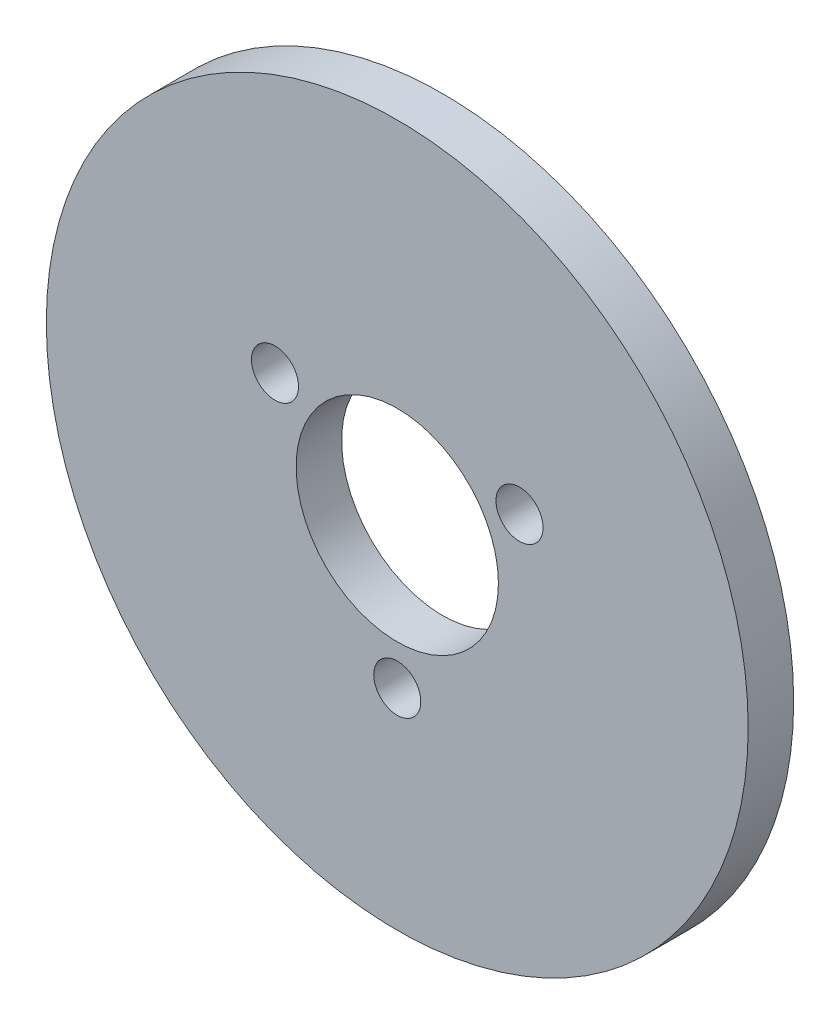
ISO-10303-21;
HEADER;
FILE_DESCRIPTION(('STEP AP214'),'2;1');
FILE_NAME('part.step','',(''),(''),'','','');
FILE_SCHEMA(('AUTOMOTIVE_DESIGN { 1 0 10303 214 1 1 1 1 }'));
ENDSEC;
DATA;
#1=APPLICATION_CONTEXT('core data for automotive mechanical design processes');
#2=APPLICATION_PROTOCOL_DEFINITION('international standard','automotive_design',2000,#1);
#3=PRODUCT_CONTEXT('',#1,'mechanical');
#4=PRODUCT('Part','Part','',(#3));
#5=PRODUCT_RELATED_PRODUCT_CATEGORY('part','',(#4));
#6=PRODUCT_DEFINITION_FORMATION('','',#4);
#7=PRODUCT_DEFINITION_CONTEXT('part definition',#1,'design');
#8=PRODUCT_DEFINITION('design','',#6,#7);
#9=PRODUCT_DEFINITION_SHAPE('','',#8);
#10=(LENGTH_UNIT() NAMED_UNIT(*) SI_UNIT(.MILLI.,.METRE.));
#11=(NAMED_UNIT(*) PLANE_ANGLE_UNIT() SI_UNIT($,.RADIAN.));
#12=(NAMED_UNIT(*) SI_UNIT($,.STERADIAN.) SOLID_ANGLE_UNIT());
#13=UNCERTAINTY_MEASURE_WITH_UNIT(LENGTH_MEASURE(1.E-05),#10,'distance_accuracy_value','');
#14=(GEOMETRIC_REPRESENTATION_CONTEXT(3) GLOBAL_UNCERTAINTY_ASSIGNED_CONTEXT((#13)) GLOBAL_UNIT_ASSIGNED_CONTEXT((#10,
#11,#12)) REPRESENTATION_CONTEXT('',''));
#15=CARTESIAN_POINT('',(0.,0.,0.));
#16=DIRECTION('',(0.,0.,1.));
#17=DIRECTION('',(1.,0.,0.));
#18=AXIS2_PLACEMENT_3D('',#15,#16,#17);
#19=CARTESIAN_POINT('',(0.,0.,2.9));
#20=DIRECTION('',(0.,0.,1.));
#21=DIRECTION('',(1.,0.,0.));
#22=AXIS2_PLACEMENT_3D('',#19,#20,#21);
#23=PLANE('',#22);
#24=CARTESIAN_POINT('',(7.79422863405995,4.5,2.9));
#25=DIRECTION('',(0.,0.,-1.));
#26=DIRECTION('',(-1.,0.,0.));
#27=AXIS2_PLACEMENT_3D('',#24,#25,#26);
#28=CIRCLE('',#27,1.5);
#29=CARTESIAN_POINT('',(6.29422863405995,4.5,2.9));
#30=VERTEX_POINT('',#29);
#31=EDGE_CURVE('E52',#30,#30,#28,.T.);
#32=ORIENTED_EDGE('',*,*,#31,.T.);
#33=EDGE_LOOP('',(#32));
#34=FACE_BOUND('',#33,.T.);
#35=CARTESIAN_POINT('',(0.,-9.,2.9));
#36=DIRECTION('',(0.,0.,-1.));
#37=DIRECTION('',(-1.,0.,0.));
#38=AXIS2_PLACEMENT_3D('',#35,#36,#37);
#39=CIRCLE('',#38,1.5);
#40=CARTESIAN_POINT('',(-1.5,-9.,2.9));
#41=VERTEX_POINT('',#40);
#42=EDGE_CURVE('E58',#41,#41,#39,.T.);
#43=ORIENTED_EDGE('',*,*,#42,.T.);
#44=EDGE_LOOP('',(#43));
#45=FACE_BOUND('',#44,.T.);
#46=CARTESIAN_POINT('',(-7.79422863405995,4.5,2.9));
#47=DIRECTION('',(0.,0.,-1.));
#48=DIRECTION('',(-1.,0.,0.));
#49=AXIS2_PLACEMENT_3D('',#46,#47,#48);
#50=CIRCLE('',#49,1.5);
#51=CARTESIAN_POINT('',(-9.29422863405994,4.5,2.9));
#52=VERTEX_POINT('',#51);
#53=EDGE_CURVE('E46',#52,#52,#50,.T.);
#54=ORIENTED_EDGE('',*,*,#53,.T.);
#55=EDGE_LOOP('',(#54));
#56=FACE_BOUND('',#55,.T.);
#57=CARTESIAN_POINT('',(0.,0.,2.9));
#58=DIRECTION('',(0.,0.,1.));
#59=DIRECTION('',(1.,0.,0.));
#60=AXIS2_PLACEMENT_3D('',#57,#58,#59);
#61=CIRCLE('',#60,22.375);
#62=CARTESIAN_POINT('',(22.375,0.,2.9));
#63=VERTEX_POINT('',#62);
#64=EDGE_CURVE('E10',#63,#63,#61,.T.);
#65=ORIENTED_EDGE('',*,*,#64,.T.);
#66=EDGE_LOOP('',(#65));
#67=FACE_BOUND('',#66,.T.);
#68=CARTESIAN_POINT('',(0.,0.,2.9));
#69=DIRECTION('',(0.,0.,1.));
#70=DIRECTION('',(1.,0.,0.));
#71=AXIS2_PLACEMENT_3D('',#68,#69,#70);
#72=CIRCLE('',#71,6.45);
#73=CARTESIAN_POINT('',(6.45,0.,2.9));
#74=VERTEX_POINT('',#73);
#75=EDGE_CURVE('E41',#74,#74,#72,.T.);
#76=ORIENTED_EDGE('',*,*,#75,.F.);
#77=EDGE_LOOP('',(#76));
#78=FACE_BOUND('',#77,.T.);
#79=ADVANCED_FACE('F30',(#34,#45,#56,#67,#78),#23,.T.);
#80=CARTESIAN_POINT('',(0.,0.,0.));
#81=DIRECTION('',(0.,0.,1.));
#82=DIRECTION('',(1.,0.,0.));
#83=AXIS2_PLACEMENT_3D('',#80,#81,#82);
#84=PLANE('',#83);
#85=CARTESIAN_POINT('',(7.79422863405995,4.5,0.));
#86=DIRECTION('',(0.,0.,-1.));
#87=DIRECTION('',(-1.,0.,0.));
#88=AXIS2_PLACEMENT_3D('',#85,#86,#87);
#89=CIRCLE('',#88,1.5);
#90=CARTESIAN_POINT('',(6.29422863405995,4.5,0.));
#91=VERTEX_POINT('',#90);
#92=EDGE_CURVE('E61',#91,#91,#89,.T.);
#93=ORIENTED_EDGE('',*,*,#92,.F.);
#94=EDGE_LOOP('',(#93));
#95=FACE_BOUND('',#94,.T.);
#96=CARTESIAN_POINT('',(0.,-9.,0.));
#97=DIRECTION('',(0.,0.,-1.));
#98=DIRECTION('',(-1.,0.,0.));
#99=AXIS2_PLACEMENT_3D('',#96,#97,#98);
#100=CIRCLE('',#99,1.5);
#101=CARTESIAN_POINT('',(-1.5,-9.,0.));
#102=VERTEX_POINT('',#101);
#103=EDGE_CURVE('E55',#102,#102,#100,.T.);
#104=ORIENTED_EDGE('',*,*,#103,.F.);
#105=EDGE_LOOP('',(#104));
#106=FACE_BOUND('',#105,.T.);
#107=CARTESIAN_POINT('',(-7.79422863405995,4.5,0.));
#108=DIRECTION('',(0.,0.,-1.));
#109=DIRECTION('',(-1.,0.,0.));
#110=AXIS2_PLACEMENT_3D('',#107,#108,#109);
#111=CIRCLE('',#110,1.5);
#112=CARTESIAN_POINT('',(-9.29422863405994,4.5,0.));
#113=VERTEX_POINT('',#112);
#114=EDGE_CURVE('E49',#113,#113,#111,.T.);
#115=ORIENTED_EDGE('',*,*,#114,.F.);
#116=EDGE_LOOP('',(#115));
#117=FACE_BOUND('',#116,.T.);
#118=CARTESIAN_POINT('',(0.,0.,0.));
#119=DIRECTION('',(0.,0.,1.));
#120=DIRECTION('',(1.,0.,0.));
#121=AXIS2_PLACEMENT_3D('',#118,#119,#120);
#122=CIRCLE('',#121,22.375);
#123=CARTESIAN_POINT('',(22.375,0.,0.));
#124=VERTEX_POINT('',#123);
#125=EDGE_CURVE('E34',#124,#124,#122,.T.);
#126=ORIENTED_EDGE('',*,*,#125,.F.);
#127=EDGE_LOOP('',(#126));
#128=FACE_BOUND('',#127,.T.);
#129=CARTESIAN_POINT('',(0.,0.,0.));
#130=DIRECTION('',(0.,0.,1.));
#131=DIRECTION('',(1.,0.,0.));
#132=AXIS2_PLACEMENT_3D('',#129,#130,#131);
#133=CIRCLE('',#132,6.45);
#134=CARTESIAN_POINT('',(6.45,0.,0.));
#135=VERTEX_POINT('',#134);
#136=EDGE_CURVE('E43',#135,#135,#133,.T.);
#137=ORIENTED_EDGE('',*,*,#136,.T.);
#138=EDGE_LOOP('',(#137));
#139=FACE_BOUND('',#138,.T.);
#140=ADVANCED_FACE('F76',(#95,#106,#117,#128,#139),#84,.F.);
#141=CARTESIAN_POINT('',(0.,0.,2.9));
#142=DIRECTION('',(0.,0.,-1.));
#143=DIRECTION('',(-1.,0.,0.));
#144=AXIS2_PLACEMENT_3D('',#141,#142,#143);
#145=CYLINDRICAL_SURFACE('',#144,22.375);
#146=ORIENTED_EDGE('',*,*,#64,.F.);
#147=EDGE_LOOP('',(#146));
#148=FACE_BOUND('',#147,.T.);
#149=ORIENTED_EDGE('',*,*,#125,.T.);
#150=EDGE_LOOP('',(#149));
#151=FACE_BOUND('',#150,.T.);
#152=ADVANCED_FACE('F32',(#148,#151),#145,.T.);
#153=CARTESIAN_POINT('',(0.,0.,2.9));
#154=DIRECTION('',(0.,0.,-1.));
#155=DIRECTION('',(-1.,0.,0.));
#156=AXIS2_PLACEMENT_3D('',#153,#154,#155);
#157=CYLINDRICAL_SURFACE('',#156,6.45);
#158=ORIENTED_EDGE('',*,*,#75,.T.);
#159=EDGE_LOOP('',(#158));
#160=FACE_BOUND('',#159,.T.);
#161=ORIENTED_EDGE('',*,*,#136,.F.);
#162=EDGE_LOOP('',(#161));
#163=FACE_BOUND('',#162,.T.);
#164=ADVANCED_FACE('F87',(#160,#163),#157,.F.);
#165=CARTESIAN_POINT('',(-7.79422863405995,4.5,2.9));
#166=DIRECTION('',(0.,0.,-1.));
#167=DIRECTION('',(-1.,0.,0.));
#168=AXIS2_PLACEMENT_3D('',#165,#166,#167);
#169=CYLINDRICAL_SURFACE('',#168,1.5);
#170=ORIENTED_EDGE('',*,*,#53,.F.);
#171=EDGE_LOOP('',(#170));
#172=FACE_BOUND('',#171,.T.);
#173=ORIENTED_EDGE('',*,*,#114,.T.);
#174=EDGE_LOOP('',(#173));
#175=FACE_BOUND('',#174,.T.);
#176=ADVANCED_FACE('F89',(#172,#175),#169,.F.);
#177=CARTESIAN_POINT('',(0.,-9.,2.9));
#178=DIRECTION('',(0.,0.,-1.));
#179=DIRECTION('',(-1.,0.,0.));
#180=AXIS2_PLACEMENT_3D('',#177,#178,#179);
#181=CYLINDRICAL_SURFACE('',#180,1.5);
#182=ORIENTED_EDGE('',*,*,#42,.F.);
#183=EDGE_LOOP('',(#182));
#184=FACE_BOUND('',#183,.T.);
#185=ORIENTED_EDGE('',*,*,#103,.T.);
#186=EDGE_LOOP('',(#185));
#187=FACE_BOUND('',#186,.T.);
#188=ADVANCED_FACE('F72',(#184,#187),#181,.F.);
#189=CARTESIAN_POINT('',(7.79422863405995,4.5,2.9));
#190=DIRECTION('',(0.,0.,-1.));
#191=DIRECTION('',(-1.,0.,0.));
#192=AXIS2_PLACEMENT_3D('',#189,#190,#191);
#193=CYLINDRICAL_SURFACE('',#192,1.5);
#194=ORIENTED_EDGE('',*,*,#31,.F.);
#195=EDGE_LOOP('',(#194));
#196=FACE_BOUND('',#195,.T.);
#197=ORIENTED_EDGE('',*,*,#92,.T.);
#198=EDGE_LOOP('',(#197));
#199=FACE_BOUND('',#198,.T.);
#200=ADVANCED_FACE('F69',(#196,#199),#193,.F.);
#201=CLOSED_SHELL('',(#79,#140,#152,#164,#176,#188,#200));
#202=MANIFOLD_SOLID_BREP('B2',#201);
#203=ADVANCED_BREP_SHAPE_REPRESENTATION('',(#18,#202),#14);
#204=SHAPE_DEFINITION_REPRESENTATION(#9,#203);
ENDSEC;
END-ISO-10303-21;
